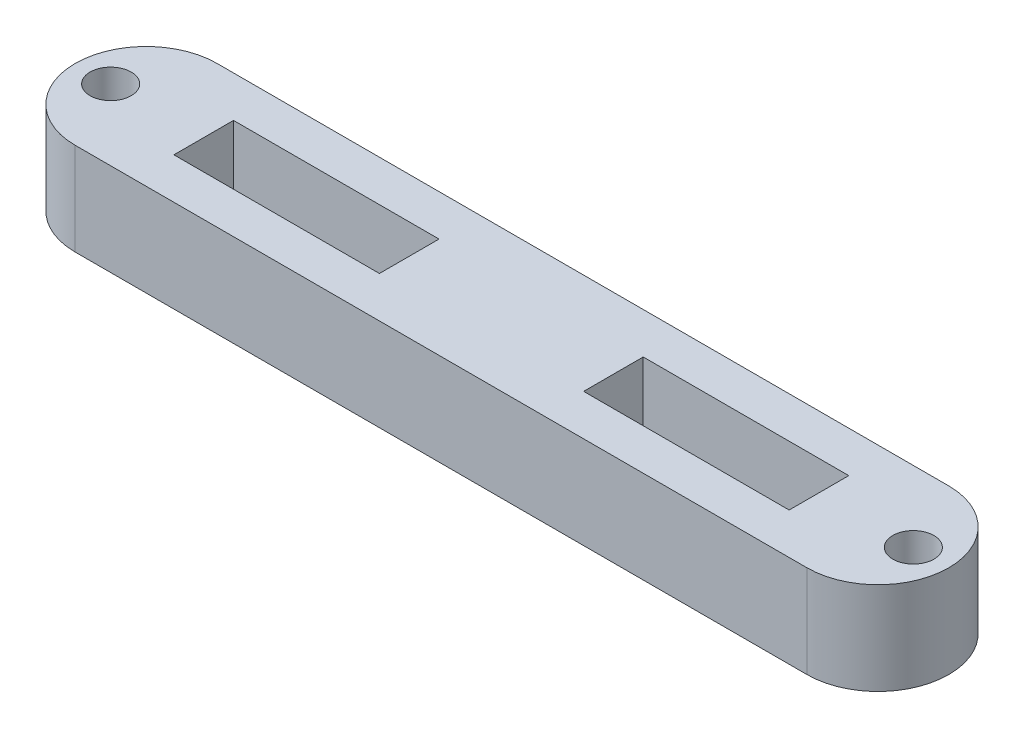
ISO-10303-21;
HEADER;
FILE_DESCRIPTION(('STEP AP214'),'2;1');
FILE_NAME('part.step','',(''),(''),'','','');
FILE_SCHEMA(('AUTOMOTIVE_DESIGN { 1 0 10303 214 1 1 1 1 }'));
ENDSEC;
DATA;
#1=APPLICATION_CONTEXT('core data for automotive mechanical design processes');
#2=APPLICATION_PROTOCOL_DEFINITION('international standard','automotive_design',2000,#1);
#3=PRODUCT_CONTEXT('',#1,'mechanical');
#4=PRODUCT('Part','Part','',(#3));
#5=PRODUCT_RELATED_PRODUCT_CATEGORY('part','',(#4));
#6=PRODUCT_DEFINITION_FORMATION('','',#4);
#7=PRODUCT_DEFINITION_CONTEXT('part definition',#1,'design');
#8=PRODUCT_DEFINITION('design','',#6,#7);
#9=PRODUCT_DEFINITION_SHAPE('','',#8);
#10=(LENGTH_UNIT() NAMED_UNIT(*) SI_UNIT(.MILLI.,.METRE.));
#11=(NAMED_UNIT(*) PLANE_ANGLE_UNIT() SI_UNIT($,.RADIAN.));
#12=(NAMED_UNIT(*) SI_UNIT($,.STERADIAN.) SOLID_ANGLE_UNIT());
#13=UNCERTAINTY_MEASURE_WITH_UNIT(LENGTH_MEASURE(1.E-05),#10,'distance_accuracy_value','');
#14=(GEOMETRIC_REPRESENTATION_CONTEXT(3) GLOBAL_UNCERTAINTY_ASSIGNED_CONTEXT((#13)) GLOBAL_UNIT_ASSIGNED_CONTEXT((#10,
#11,#12)) REPRESENTATION_CONTEXT('',''));
#15=CARTESIAN_POINT('',(0.,0.,0.));
#16=DIRECTION('',(0.,0.,1.));
#17=DIRECTION('',(1.,0.,0.));
#18=AXIS2_PLACEMENT_3D('',#15,#16,#17);
#19=CARTESIAN_POINT('',(0.,6.35,-0.92075));
#20=DIRECTION('',(0.,0.,-1.));
#21=DIRECTION('',(-1.,0.,0.));
#22=AXIS2_PLACEMENT_3D('',#19,#20,#21);
#23=PLANE('',#22);
#24=DIRECTION('',(-1.,0.,0.));
#25=VECTOR('',#24,1.);
#26=CARTESIAN_POINT('',(0.,9.8425,-0.92075));
#27=LINE('',#26,#25);
#28=CARTESIAN_POINT('',(-3.175,9.8425,-0.92075));
#29=VERTEX_POINT('',#28);
#30=CARTESIAN_POINT('',(-9.525,9.8425,-0.92075));
#31=VERTEX_POINT('',#30);
#32=EDGE_CURVE('E73',#29,#31,#27,.T.);
#33=ORIENTED_EDGE('',*,*,#32,.F.);
#34=DIRECTION('',(0.,-1.,0.));
#35=VECTOR('',#34,1.);
#36=CARTESIAN_POINT('',(-3.175,6.35,-0.92075));
#37=LINE('',#36,#35);
#38=CARTESIAN_POINT('',(-3.175,12.7,-0.92075));
#39=VERTEX_POINT('',#38);
#40=EDGE_CURVE('E11',#39,#29,#37,.T.);
#41=ORIENTED_EDGE('',*,*,#40,.F.);
#42=DIRECTION('',(1.,0.,0.));
#43=VECTOR('',#42,1.);
#44=CARTESIAN_POINT('',(-9.525,12.7,-0.92075));
#45=LINE('',#44,#43);
#46=CARTESIAN_POINT('',(-9.525,12.7,-0.92075));
#47=VERTEX_POINT('',#46);
#48=EDGE_CURVE('E210',#47,#39,#45,.T.);
#49=ORIENTED_EDGE('',*,*,#48,.F.);
#50=DIRECTION('',(0.,-1.,0.));
#51=VECTOR('',#50,1.);
#52=CARTESIAN_POINT('',(-9.525,6.35,-0.92075));
#53=LINE('',#52,#51);
#54=EDGE_CURVE('E177',#47,#31,#53,.T.);
#55=ORIENTED_EDGE('',*,*,#54,.T.);
#56=EDGE_LOOP('',(#33,#41,#49,#55));
#57=FACE_BOUND('',#56,.T.);
#58=ADVANCED_FACE('F47',(#57),#23,.F.);
#59=CARTESIAN_POINT('',(-3.175,6.35,0.));
#60=DIRECTION('',(1.,0.,0.));
#61=DIRECTION('',(0.,0.,-1.));
#62=AXIS2_PLACEMENT_3D('',#59,#60,#61);
#63=PLANE('',#62);
#64=DIRECTION('',(0.,0.,-1.));
#65=VECTOR('',#64,1.);
#66=CARTESIAN_POINT('',(-3.175,9.8425,0.));
#67=LINE('',#66,#65);
#68=CARTESIAN_POINT('',(-3.175,9.8425,0.92075));
#69=VERTEX_POINT('',#68);
#70=EDGE_CURVE('E277',#69,#29,#67,.T.);
#71=ORIENTED_EDGE('',*,*,#70,.F.);
#72=DIRECTION('',(0.,-1.,0.));
#73=VECTOR('',#72,1.);
#74=CARTESIAN_POINT('',(-3.175,6.35,0.92075));
#75=LINE('',#74,#73);
#76=CARTESIAN_POINT('',(-3.175,12.7,0.92075));
#77=VERTEX_POINT('',#76);
#78=EDGE_CURVE('E57',#77,#69,#75,.T.);
#79=ORIENTED_EDGE('',*,*,#78,.F.);
#80=DIRECTION('',(0.,0.,1.));
#81=VECTOR('',#80,1.);
#82=CARTESIAN_POINT('',(-3.175,12.7,-0.92075));
#83=LINE('',#82,#81);
#84=EDGE_CURVE('E233',#39,#77,#83,.T.);
#85=ORIENTED_EDGE('',*,*,#84,.F.);
#86=ORIENTED_EDGE('',*,*,#40,.T.);
#87=EDGE_LOOP('',(#71,#79,#85,#86));
#88=FACE_BOUND('',#87,.T.);
#89=ADVANCED_FACE('F276',(#88),#63,.F.);
#90=CARTESIAN_POINT('',(0.,6.35,0.92075));
#91=DIRECTION('',(0.,0.,-1.));
#92=DIRECTION('',(-1.,0.,0.));
#93=AXIS2_PLACEMENT_3D('',#90,#91,#92);
#94=PLANE('',#93);
#95=ORIENTED_EDGE('',*,*,#78,.T.);
#96=DIRECTION('',(-1.,0.,0.));
#97=VECTOR('',#96,1.);
#98=CARTESIAN_POINT('',(0.,9.8425,0.92075));
#99=LINE('',#98,#97);
#100=CARTESIAN_POINT('',(-9.525,9.8425,0.92075));
#101=VERTEX_POINT('',#100);
#102=EDGE_CURVE('E271',#69,#101,#99,.T.);
#103=ORIENTED_EDGE('',*,*,#102,.T.);
#104=DIRECTION('',(0.,-1.,0.));
#105=VECTOR('',#104,1.);
#106=CARTESIAN_POINT('',(-9.525,6.35,0.92075));
#107=LINE('',#106,#105);
#108=CARTESIAN_POINT('',(-9.525,12.7,0.92075));
#109=VERTEX_POINT('',#108);
#110=EDGE_CURVE('E262',#109,#101,#107,.T.);
#111=ORIENTED_EDGE('',*,*,#110,.F.);
#112=DIRECTION('',(1.,0.,0.));
#113=VECTOR('',#112,1.);
#114=CARTESIAN_POINT('',(-9.525,12.7,0.92075));
#115=LINE('',#114,#113);
#116=EDGE_CURVE('E220',#109,#77,#115,.T.);
#117=ORIENTED_EDGE('',*,*,#116,.T.);
#118=EDGE_LOOP('',(#95,#103,#111,#117));
#119=FACE_BOUND('',#118,.T.);
#120=ADVANCED_FACE('F270',(#119),#94,.T.);
#121=CARTESIAN_POINT('',(0.,6.35,-2.19075));
#122=DIRECTION('',(0.,0.,1.));
#123=DIRECTION('',(1.,0.,0.));
#124=AXIS2_PLACEMENT_3D('',#121,#122,#123);
#125=PLANE('',#124);
#126=DIRECTION('',(1.,0.,0.));
#127=VECTOR('',#126,1.);
#128=CARTESIAN_POINT('',(0.,9.8425,-2.19075));
#129=LINE('',#128,#127);
#130=CARTESIAN_POINT('',(-11.3046804357248,9.8425,-2.19075));
#131=VERTEX_POINT('',#130);
#132=CARTESIAN_POINT('',(11.3046804357248,9.8425,-2.19075));
#133=VERTEX_POINT('',#132);
#134=EDGE_CURVE('E145',#131,#133,#129,.T.);
#135=ORIENTED_EDGE('',*,*,#134,.F.);
#136=DIRECTION('',(0.,-1.,0.));
#137=VECTOR('',#136,1.);
#138=CARTESIAN_POINT('',(-11.3046804357248,6.35,-2.19075));
#139=LINE('',#138,#137);
#140=CARTESIAN_POINT('',(-11.3046804357248,12.7,-2.19075));
#141=VERTEX_POINT('',#140);
#142=EDGE_CURVE('E169',#141,#131,#139,.T.);
#143=ORIENTED_EDGE('',*,*,#142,.F.);
#144=DIRECTION('',(-1.,0.,0.));
#145=VECTOR('',#144,1.);
#146=CARTESIAN_POINT('',(11.3046804357248,12.7,-2.19075));
#147=LINE('',#146,#145);
#148=CARTESIAN_POINT('',(11.3046804357248,12.7,-2.19075));
#149=VERTEX_POINT('',#148);
#150=EDGE_CURVE('E228',#149,#141,#147,.T.);
#151=ORIENTED_EDGE('',*,*,#150,.F.);
#152=DIRECTION('',(0.,-1.,0.));
#153=VECTOR('',#152,1.);
#154=CARTESIAN_POINT('',(11.3046804357248,6.35,-2.19075));
#155=LINE('',#154,#153);
#156=EDGE_CURVE('E165',#149,#133,#155,.T.);
#157=ORIENTED_EDGE('',*,*,#156,.T.);
#158=EDGE_LOOP('',(#135,#143,#151,#157));
#159=FACE_BOUND('',#158,.T.);
#160=ADVANCED_FACE('F323',(#159),#125,.F.);
#161=CARTESIAN_POINT('',(0.,6.35,2.19075));
#162=DIRECTION('',(0.,0.,1.));
#163=DIRECTION('',(1.,0.,0.));
#164=AXIS2_PLACEMENT_3D('',#161,#162,#163);
#165=PLANE('',#164);
#166=DIRECTION('',(0.,-1.,0.));
#167=VECTOR('',#166,1.);
#168=CARTESIAN_POINT('',(-11.3046804357248,6.35,2.19075));
#169=LINE('',#168,#167);
#170=CARTESIAN_POINT('',(-11.3046804357248,12.7,2.19075000000001));
#171=VERTEX_POINT('',#170);
#172=CARTESIAN_POINT('',(-11.3046804357248,9.8425,2.19075));
#173=VERTEX_POINT('',#172);
#174=EDGE_CURVE('E157',#171,#173,#169,.T.);
#175=ORIENTED_EDGE('',*,*,#174,.T.);
#176=DIRECTION('',(1.,0.,0.));
#177=VECTOR('',#176,1.);
#178=CARTESIAN_POINT('',(0.,9.8425,2.19075));
#179=LINE('',#178,#177);
#180=CARTESIAN_POINT('',(11.3046804357248,9.8425,2.19074999999998));
#181=VERTEX_POINT('',#180);
#182=EDGE_CURVE('E142',#173,#181,#179,.T.);
#183=ORIENTED_EDGE('',*,*,#182,.T.);
#184=DIRECTION('',(0.,-1.,0.));
#185=VECTOR('',#184,1.);
#186=CARTESIAN_POINT('',(11.3046804357248,6.35,2.19075));
#187=LINE('',#186,#185);
#188=CARTESIAN_POINT('',(11.3046804357248,12.7,2.19075));
#189=VERTEX_POINT('',#188);
#190=EDGE_CURVE('E155',#189,#181,#187,.T.);
#191=ORIENTED_EDGE('',*,*,#190,.F.);
#192=DIRECTION('',(-1.,0.,0.));
#193=VECTOR('',#192,1.);
#194=CARTESIAN_POINT('',(11.3046804357248,12.7,2.19075));
#195=LINE('',#194,#193);
#196=EDGE_CURVE('E243',#189,#171,#195,.T.);
#197=ORIENTED_EDGE('',*,*,#196,.T.);
#198=EDGE_LOOP('',(#175,#183,#191,#197));
#199=FACE_BOUND('',#198,.T.);
#200=ADVANCED_FACE('F153',(#199),#165,.T.);
#201=CARTESIAN_POINT('',(3.13370322069643,6.35,0.));
#202=DIRECTION('',(1.,0.,0.));
#203=DIRECTION('',(0.,0.,-1.));
#204=AXIS2_PLACEMENT_3D('',#201,#202,#203);
#205=PLANE('',#204);
#206=DIRECTION('',(0.,-1.,0.));
#207=VECTOR('',#206,1.);
#208=CARTESIAN_POINT('',(3.13370322069643,6.35,0.920749999999998));
#209=LINE('',#208,#207);
#210=CARTESIAN_POINT('',(3.13370322069643,12.7,0.920749999999999));
#211=VERTEX_POINT('',#210);
#212=CARTESIAN_POINT('',(3.13370322069643,9.8425,0.920749999999998));
#213=VERTEX_POINT('',#212);
#214=EDGE_CURVE('E178',#211,#213,#209,.T.);
#215=ORIENTED_EDGE('',*,*,#214,.T.);
#216=DIRECTION('',(0.,0.,-1.));
#217=VECTOR('',#216,1.);
#218=CARTESIAN_POINT('',(3.13370322069643,9.8425,0.));
#219=LINE('',#218,#217);
#220=CARTESIAN_POINT('',(3.13370322069643,9.8425,-0.920750000000002));
#221=VERTEX_POINT('',#220);
#222=EDGE_CURVE('E65',#213,#221,#219,.T.);
#223=ORIENTED_EDGE('',*,*,#222,.T.);
#224=DIRECTION('',(0.,-1.,0.));
#225=VECTOR('',#224,1.);
#226=CARTESIAN_POINT('',(3.13370322069643,6.35,-0.920750000000002));
#227=LINE('',#226,#225);
#228=CARTESIAN_POINT('',(3.13370322069643,12.7,-0.920750000000002));
#229=VERTEX_POINT('',#228);
#230=EDGE_CURVE('E171',#229,#221,#227,.T.);
#231=ORIENTED_EDGE('',*,*,#230,.F.);
#232=DIRECTION('',(0.,0.,1.));
#233=VECTOR('',#232,1.);
#234=CARTESIAN_POINT('',(3.13370322069643,12.7,0.));
#235=LINE('',#234,#233);
#236=EDGE_CURVE('E202',#229,#211,#235,.T.);
#237=ORIENTED_EDGE('',*,*,#236,.T.);
#238=EDGE_LOOP('',(#215,#223,#231,#237));
#239=FACE_BOUND('',#238,.T.);
#240=ADVANCED_FACE('F49',(#239),#205,.T.);
#241=CARTESIAN_POINT('',(0.,6.35,-0.920750000000002));
#242=DIRECTION('',(0.,0.,1.));
#243=DIRECTION('',(1.,0.,0.));
#244=AXIS2_PLACEMENT_3D('',#241,#242,#243);
#245=PLANE('',#244);
#246=ORIENTED_EDGE('',*,*,#230,.T.);
#247=DIRECTION('',(1.,0.,0.));
#248=VECTOR('',#247,1.);
#249=CARTESIAN_POINT('',(0.,9.8425,-0.920750000000002));
#250=LINE('',#249,#248);
#251=CARTESIAN_POINT('',(9.48370322069643,9.8425,-0.920750000000002));
#252=VERTEX_POINT('',#251);
#253=EDGE_CURVE('E196',#221,#252,#250,.T.);
#254=ORIENTED_EDGE('',*,*,#253,.T.);
#255=DIRECTION('',(0.,-1.,0.));
#256=VECTOR('',#255,1.);
#257=CARTESIAN_POINT('',(9.48370322069643,6.35,-0.920750000000001));
#258=LINE('',#257,#256);
#259=CARTESIAN_POINT('',(9.48370322069643,12.7,-0.920750000000002));
#260=VERTEX_POINT('',#259);
#261=EDGE_CURVE('E187',#260,#252,#258,.T.);
#262=ORIENTED_EDGE('',*,*,#261,.F.);
#263=DIRECTION('',(1.,0.,0.));
#264=VECTOR('',#263,1.);
#265=CARTESIAN_POINT('',(0.,12.7,-0.920750000000002));
#266=LINE('',#265,#264);
#267=EDGE_CURVE('E198',#229,#260,#266,.T.);
#268=ORIENTED_EDGE('',*,*,#267,.F.);
#269=EDGE_LOOP('',(#246,#254,#262,#268));
#270=FACE_BOUND('',#269,.T.);
#271=ADVANCED_FACE('F195',(#270),#245,.T.);
#272=CARTESIAN_POINT('',(9.48370322069643,6.35,0.));
#273=DIRECTION('',(1.,0.,0.));
#274=DIRECTION('',(0.,0.,-1.));
#275=AXIS2_PLACEMENT_3D('',#272,#273,#274);
#276=PLANE('',#275);
#277=DIRECTION('',(0.,0.,-1.));
#278=VECTOR('',#277,1.);
#279=CARTESIAN_POINT('',(9.48370322069643,9.8425,0.));
#280=LINE('',#279,#278);
#281=CARTESIAN_POINT('',(9.48370322069643,9.8425,0.920749999999999));
#282=VERTEX_POINT('',#281);
#283=EDGE_CURVE('E212',#282,#252,#280,.T.);
#284=ORIENTED_EDGE('',*,*,#283,.F.);
#285=DIRECTION('',(0.,-1.,0.));
#286=VECTOR('',#285,1.);
#287=CARTESIAN_POINT('',(9.48370322069643,6.35,0.920749999999999));
#288=LINE('',#287,#286);
#289=CARTESIAN_POINT('',(9.48370322069643,12.7,0.920749999999999));
#290=VERTEX_POINT('',#289);
#291=EDGE_CURVE('E182',#290,#282,#288,.T.);
#292=ORIENTED_EDGE('',*,*,#291,.F.);
#293=DIRECTION('',(0.,0.,1.));
#294=VECTOR('',#293,1.);
#295=CARTESIAN_POINT('',(9.48370322069643,12.7,0.));
#296=LINE('',#295,#294);
#297=EDGE_CURVE('E216',#260,#290,#296,.T.);
#298=ORIENTED_EDGE('',*,*,#297,.F.);
#299=ORIENTED_EDGE('',*,*,#261,.T.);
#300=EDGE_LOOP('',(#284,#292,#298,#299));
#301=FACE_BOUND('',#300,.T.);
#302=ADVANCED_FACE('F292',(#301),#276,.F.);
#303=CARTESIAN_POINT('',(0.,6.35,0.920749999999998));
#304=DIRECTION('',(0.,0.,1.));
#305=DIRECTION('',(1.,0.,0.));
#306=AXIS2_PLACEMENT_3D('',#303,#304,#305);
#307=PLANE('',#306);
#308=DIRECTION('',(1.,0.,0.));
#309=VECTOR('',#308,1.);
#310=CARTESIAN_POINT('',(0.,9.8425,0.920749999999998));
#311=LINE('',#310,#309);
#312=EDGE_CURVE('E282',#213,#282,#311,.T.);
#313=ORIENTED_EDGE('',*,*,#312,.F.);
#314=ORIENTED_EDGE('',*,*,#214,.F.);
#315=DIRECTION('',(1.,0.,0.));
#316=VECTOR('',#315,1.);
#317=CARTESIAN_POINT('',(0.,12.7,0.920749999999999));
#318=LINE('',#317,#316);
#319=EDGE_CURVE('E225',#211,#290,#318,.T.);
#320=ORIENTED_EDGE('',*,*,#319,.T.);
#321=ORIENTED_EDGE('',*,*,#291,.T.);
#322=EDGE_LOOP('',(#313,#314,#320,#321));
#323=FACE_BOUND('',#322,.T.);
#324=ADVANCED_FACE('F295',(#323),#307,.F.);
#325=CARTESIAN_POINT('',(-9.525,6.35,0.));
#326=DIRECTION('',(1.,0.,0.));
#327=DIRECTION('',(0.,0.,-1.));
#328=AXIS2_PLACEMENT_3D('',#325,#326,#327);
#329=PLANE('',#328);
#330=ORIENTED_EDGE('',*,*,#110,.T.);
#331=DIRECTION('',(0.,0.,-1.));
#332=VECTOR('',#331,1.);
#333=CARTESIAN_POINT('',(-9.525,9.8425,0.));
#334=LINE('',#333,#332);
#335=EDGE_CURVE('E284',#101,#31,#334,.T.);
#336=ORIENTED_EDGE('',*,*,#335,.T.);
#337=ORIENTED_EDGE('',*,*,#54,.F.);
#338=DIRECTION('',(0.,0.,1.));
#339=VECTOR('',#338,1.);
#340=CARTESIAN_POINT('',(-9.525,12.7,-0.92075));
#341=LINE('',#340,#339);
#342=EDGE_CURVE('E205',#47,#109,#341,.T.);
#343=ORIENTED_EDGE('',*,*,#342,.T.);
#344=EDGE_LOOP('',(#330,#336,#337,#343));
#345=FACE_BOUND('',#344,.T.);
#346=ADVANCED_FACE('F329',(#345),#329,.T.);
#347=CARTESIAN_POINT('',(-11.3046804357248,12.7,0.));
#348=DIRECTION('',(0.,-1.,0.));
#349=DIRECTION('',(0.,0.,-1.));
#350=AXIS2_PLACEMENT_3D('',#347,#348,#349);
#351=CYLINDRICAL_SURFACE('',#350,2.19075);
#352=CARTESIAN_POINT('',(-11.3046804357248,9.8425,0.));
#353=DIRECTION('',(0.,-1.,0.));
#354=DIRECTION('',(0.,0.,-1.));
#355=AXIS2_PLACEMENT_3D('',#352,#353,#354);
#356=CIRCLE('',#355,2.19075);
#357=EDGE_CURVE('E505',#173,#131,#356,.T.);
#358=ORIENTED_EDGE('',*,*,#357,.F.);
#359=ORIENTED_EDGE('',*,*,#174,.F.);
#360=CARTESIAN_POINT('',(-11.3046804357248,12.7,0.));
#361=DIRECTION('',(0.,1.,0.));
#362=DIRECTION('',(0.,0.,1.));
#363=AXIS2_PLACEMENT_3D('',#360,#361,#362);
#364=CIRCLE('',#363,2.19075);
#365=EDGE_CURVE('E183',#141,#171,#364,.T.);
#366=ORIENTED_EDGE('',*,*,#365,.F.);
#367=ORIENTED_EDGE('',*,*,#142,.T.);
#368=EDGE_LOOP('',(#358,#359,#366,#367));
#369=FACE_BOUND('',#368,.T.);
#370=ADVANCED_FACE('F386',(#369),#351,.T.);
#371=CARTESIAN_POINT('',(-12.4000554357248,12.7,0.));
#372=DIRECTION('',(0.,-1.,0.));
#373=DIRECTION('',(0.,0.,-1.));
#374=AXIS2_PLACEMENT_3D('',#371,#372,#373);
#375=CYLINDRICAL_SURFACE('',#374,0.635000000000001);
#376=CARTESIAN_POINT('',(-12.4000554357248,12.7,0.));
#377=DIRECTION('',(0.,1.,0.));
#378=DIRECTION('',(0.,0.,1.));
#379=AXIS2_PLACEMENT_3D('',#376,#377,#378);
#380=CIRCLE('',#379,0.635000000000001);
#381=CARTESIAN_POINT('',(-12.4000554357248,12.7,0.635));
#382=VERTEX_POINT('',#381);
#383=EDGE_CURVE('E252',#382,#382,#380,.T.);
#384=ORIENTED_EDGE('',*,*,#383,.T.);
#385=EDGE_LOOP('',(#384));
#386=FACE_BOUND('',#385,.T.);
#387=CARTESIAN_POINT('',(-12.4000554357248,9.8425,0.));
#388=DIRECTION('',(0.,-1.,0.));
#389=DIRECTION('',(0.,0.,-1.));
#390=AXIS2_PLACEMENT_3D('',#387,#388,#389);
#391=CIRCLE('',#390,0.635000000000001);
#392=CARTESIAN_POINT('',(-12.4000554357248,9.8425,-0.635000000000001));
#393=VERTEX_POINT('',#392);
#394=EDGE_CURVE('E502',#393,#393,#391,.T.);
#395=ORIENTED_EDGE('',*,*,#394,.T.);
#396=EDGE_LOOP('',(#395));
#397=FACE_BOUND('',#396,.T.);
#398=ADVANCED_FACE('F379',(#386,#397),#375,.F.);
#399=CARTESIAN_POINT('',(11.3046804357248,12.7,0.));
#400=DIRECTION('',(0.,-1.,0.));
#401=DIRECTION('',(0.,0.,-1.));
#402=AXIS2_PLACEMENT_3D('',#399,#400,#401);
#403=CYLINDRICAL_SURFACE('',#402,2.19075);
#404=CARTESIAN_POINT('',(11.3046804357248,9.8425,0.));
#405=DIRECTION('',(0.,-1.,0.));
#406=DIRECTION('',(0.,0.,-1.));
#407=AXIS2_PLACEMENT_3D('',#404,#405,#406);
#408=CIRCLE('',#407,2.19075);
#409=EDGE_CURVE('E138',#133,#181,#408,.T.);
#410=ORIENTED_EDGE('',*,*,#409,.F.);
#411=ORIENTED_EDGE('',*,*,#156,.F.);
#412=CARTESIAN_POINT('',(11.3046804357248,12.7,0.));
#413=DIRECTION('',(0.,1.,0.));
#414=DIRECTION('',(0.,0.,-1.));
#415=AXIS2_PLACEMENT_3D('',#412,#413,#414);
#416=CIRCLE('',#415,2.19075);
#417=EDGE_CURVE('E163',#189,#149,#416,.T.);
#418=ORIENTED_EDGE('',*,*,#417,.F.);
#419=ORIENTED_EDGE('',*,*,#190,.T.);
#420=EDGE_LOOP('',(#410,#411,#418,#419));
#421=FACE_BOUND('',#420,.T.);
#422=ADVANCED_FACE('F161',(#421),#403,.T.);
#423=CARTESIAN_POINT('',(12.4000554357248,12.7,0.));
#424=DIRECTION('',(0.,-1.,0.));
#425=DIRECTION('',(0.,0.,-1.));
#426=AXIS2_PLACEMENT_3D('',#423,#424,#425);
#427=CYLINDRICAL_SURFACE('',#426,0.635);
#428=CARTESIAN_POINT('',(12.4000554357248,12.7,0.));
#429=DIRECTION('',(0.,1.,0.));
#430=DIRECTION('',(0.,0.,-1.));
#431=AXIS2_PLACEMENT_3D('',#428,#429,#430);
#432=CIRCLE('',#431,0.635);
#433=CARTESIAN_POINT('',(12.4000554357248,12.7,-0.63500000000002));
#434=VERTEX_POINT('',#433);
#435=EDGE_CURVE('E248',#434,#434,#432,.T.);
#436=ORIENTED_EDGE('',*,*,#435,.T.);
#437=EDGE_LOOP('',(#436));
#438=FACE_BOUND('',#437,.T.);
#439=CARTESIAN_POINT('',(12.4000554357248,9.8425,0.));
#440=DIRECTION('',(0.,-1.,0.));
#441=DIRECTION('',(0.,0.,-1.));
#442=AXIS2_PLACEMENT_3D('',#439,#440,#441);
#443=CIRCLE('',#442,0.635);
#444=CARTESIAN_POINT('',(12.4000554357248,9.8425,-0.63500000000002));
#445=VERTEX_POINT('',#444);
#446=EDGE_CURVE('E51',#445,#445,#443,.T.);
#447=ORIENTED_EDGE('',*,*,#446,.T.);
#448=EDGE_LOOP('',(#447));
#449=FACE_BOUND('',#448,.T.);
#450=ADVANCED_FACE('F299',(#438,#449),#427,.F.);
#451=CARTESIAN_POINT('',(-11.3046804357248,12.7,0.));
#452=DIRECTION('',(0.,1.,0.));
#453=DIRECTION('',(0.,0.,1.));
#454=AXIS2_PLACEMENT_3D('',#451,#452,#453);
#455=PLANE('',#454);
#456=ORIENTED_EDGE('',*,*,#365,.T.);
#457=ORIENTED_EDGE('',*,*,#196,.F.);
#458=ORIENTED_EDGE('',*,*,#417,.T.);
#459=ORIENTED_EDGE('',*,*,#150,.T.);
#460=EDGE_LOOP('',(#456,#457,#458,#459));
#461=FACE_BOUND('',#460,.T.);
#462=ORIENTED_EDGE('',*,*,#383,.F.);
#463=EDGE_LOOP('',(#462));
#464=FACE_BOUND('',#463,.T.);
#465=ORIENTED_EDGE('',*,*,#435,.F.);
#466=EDGE_LOOP('',(#465));
#467=FACE_BOUND('',#466,.T.);
#468=ORIENTED_EDGE('',*,*,#48,.T.);
#469=ORIENTED_EDGE('',*,*,#84,.T.);
#470=ORIENTED_EDGE('',*,*,#116,.F.);
#471=ORIENTED_EDGE('',*,*,#342,.F.);
#472=EDGE_LOOP('',(#468,#469,#470,#471));
#473=FACE_BOUND('',#472,.T.);
#474=ORIENTED_EDGE('',*,*,#236,.F.);
#475=ORIENTED_EDGE('',*,*,#267,.T.);
#476=ORIENTED_EDGE('',*,*,#297,.T.);
#477=ORIENTED_EDGE('',*,*,#319,.F.);
#478=EDGE_LOOP('',(#474,#475,#476,#477));
#479=FACE_BOUND('',#478,.T.);
#480=ADVANCED_FACE('F297',(#461,#464,#467,#473,#479),#455,.T.);
#481=CARTESIAN_POINT('',(0.,9.8425,0.));
#482=DIRECTION('',(0.,-1.,0.));
#483=DIRECTION('',(0.,0.,-1.));
#484=AXIS2_PLACEMENT_3D('',#481,#482,#483);
#485=PLANE('',#484);
#486=ORIENTED_EDGE('',*,*,#312,.T.);
#487=ORIENTED_EDGE('',*,*,#283,.T.);
#488=ORIENTED_EDGE('',*,*,#253,.F.);
#489=ORIENTED_EDGE('',*,*,#222,.F.);
#490=EDGE_LOOP('',(#486,#487,#488,#489));
#491=FACE_BOUND('',#490,.T.);
#492=ORIENTED_EDGE('',*,*,#357,.T.);
#493=ORIENTED_EDGE('',*,*,#134,.T.);
#494=ORIENTED_EDGE('',*,*,#409,.T.);
#495=ORIENTED_EDGE('',*,*,#182,.F.);
#496=EDGE_LOOP('',(#492,#493,#494,#495));
#497=FACE_BOUND('',#496,.T.);
#498=ORIENTED_EDGE('',*,*,#446,.F.);
#499=EDGE_LOOP('',(#498));
#500=FACE_BOUND('',#499,.T.);
#501=ORIENTED_EDGE('',*,*,#394,.F.);
#502=EDGE_LOOP('',(#501));
#503=FACE_BOUND('',#502,.T.);
#504=ORIENTED_EDGE('',*,*,#32,.T.);
#505=ORIENTED_EDGE('',*,*,#335,.F.);
#506=ORIENTED_EDGE('',*,*,#102,.F.);
#507=ORIENTED_EDGE('',*,*,#70,.T.);
#508=EDGE_LOOP('',(#504,#505,#506,#507));
#509=FACE_BOUND('',#508,.T.);
#510=ADVANCED_FACE('F140',(#491,#497,#500,#503,#509),#485,.T.);
#511=CLOSED_SHELL('',(#58,#89,#120,#160,#200,#240,#271,#302,#324,#346,#370,#398,#422,#450,#480,#510));
#512=MANIFOLD_SOLID_BREP('B2',#511);
#513=ADVANCED_BREP_SHAPE_REPRESENTATION('',(#18,#512),#14);
#514=SHAPE_DEFINITION_REPRESENTATION(#9,#513);
ENDSEC;
END-ISO-10303-21;
